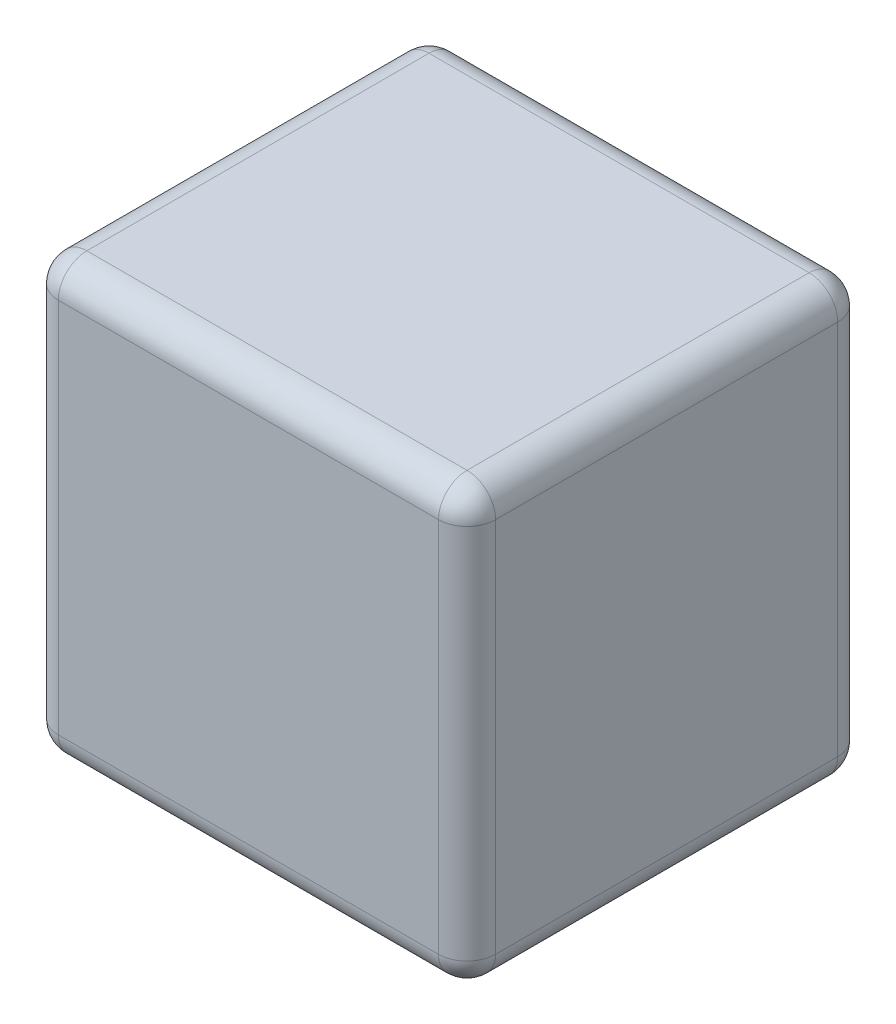
ISO-10303-21;
HEADER;
FILE_DESCRIPTION(('STEP AP214'),'2;1');
FILE_NAME('part.step','',(''),(''),'','','');
FILE_SCHEMA(('AUTOMOTIVE_DESIGN { 1 0 10303 214 1 1 1 1 }'));
ENDSEC;
DATA;
#1=APPLICATION_CONTEXT('core data for automotive mechanical design processes');
#2=APPLICATION_PROTOCOL_DEFINITION('international standard','automotive_design',2000,#1);
#3=PRODUCT_CONTEXT('',#1,'mechanical');
#4=PRODUCT('Part','Part','',(#3));
#5=PRODUCT_RELATED_PRODUCT_CATEGORY('part','',(#4));
#6=PRODUCT_DEFINITION_FORMATION('','',#4);
#7=PRODUCT_DEFINITION_CONTEXT('part definition',#1,'design');
#8=PRODUCT_DEFINITION('design','',#6,#7);
#9=PRODUCT_DEFINITION_SHAPE('','',#8);
#10=(LENGTH_UNIT() NAMED_UNIT(*) SI_UNIT(.MILLI.,.METRE.));
#11=(NAMED_UNIT(*) PLANE_ANGLE_UNIT() SI_UNIT($,.RADIAN.));
#12=(NAMED_UNIT(*) SI_UNIT($,.STERADIAN.) SOLID_ANGLE_UNIT());
#13=UNCERTAINTY_MEASURE_WITH_UNIT(LENGTH_MEASURE(1.E-05),#10,'distance_accuracy_value','');
#14=(GEOMETRIC_REPRESENTATION_CONTEXT(3) GLOBAL_UNCERTAINTY_ASSIGNED_CONTEXT((#13)) GLOBAL_UNIT_ASSIGNED_CONTEXT((#10,
#11,#12)) REPRESENTATION_CONTEXT('',''));
#15=CARTESIAN_POINT('',(0.,0.,0.));
#16=DIRECTION('',(0.,0.,1.));
#17=DIRECTION('',(1.,0.,0.));
#18=AXIS2_PLACEMENT_3D('',#15,#16,#17);
#19=CARTESIAN_POINT('',(56.000001208194,71.490000611925,2.25));
#20=DIRECTION('',(1.,1.19248806385E-08,0.));
#21=DIRECTION('',(0.,0.,1.));
#22=AXIS2_PLACEMENT_3D('',#19,#20,#21);
#23=SPHERICAL_SURFACE('',#22,0.15);
#24=CARTESIAN_POINT('',(56.000001208194,71.4900006119245,2.25));
#25=DIRECTION('',(1.,1.19248806385E-08,0.));
#26=DIRECTION('',(-1.19248806385E-08,1.,0.));
#27=AXIS2_PLACEMENT_3D('',#24,#25,#26);
#28=CIRCLE('',#27,0.15);
#29=CARTESIAN_POINT('',(56.0000012140971,71.4900006119251,2.4));
#30=VERTEX_POINT('',#29);
#31=CARTESIAN_POINT('',(56.0000012064059,71.640000611925,2.25000000000153));
#32=VERTEX_POINT('',#31);
#33=EDGE_CURVE('E116',#30,#32,#28,.F.);
#34=ORIENTED_EDGE('',*,*,#33,.F.);
#35=CARTESIAN_POINT('',(56.000001208194,71.4900006119253,2.25));
#36=DIRECTION('',(-1.19248806385E-08,1.,0.));
#37=DIRECTION('',(-1.,-1.19248806385E-08,0.));
#38=AXIS2_PLACEMENT_3D('',#35,#36,#37);
#39=CIRCLE('',#38,0.15);
#40=CARTESIAN_POINT('',(56.1500012081941,71.4900006134902,2.24999999999999));
#41=VERTEX_POINT('',#40);
#42=EDGE_CURVE('E107',#41,#30,#39,.F.);
#43=ORIENTED_EDGE('',*,*,#42,.F.);
#44=CARTESIAN_POINT('',(56.000001208194,71.490000611925,2.25));
#45=DIRECTION('',(0.,0.,1.));
#46=DIRECTION('',(1.,0.,0.));
#47=AXIS2_PLACEMENT_3D('',#44,#45,#46);
#48=CIRCLE('',#47,0.15);
#49=EDGE_CURVE('E118',#32,#41,#48,.F.);
#50=ORIENTED_EDGE('',*,*,#49,.F.);
#51=EDGE_LOOP('',(#34,#43,#50));
#52=FACE_BOUND('',#51,.T.);
#53=ADVANCED_FACE('F17',(#52),#23,.T.);
#54=CARTESIAN_POINT('',(54.000001208194,71.490000588075,2.25));
#55=DIRECTION('',(0.,0.,1.));
#56=DIRECTION('',(1.19248806385E-08,-1.,0.));
#57=AXIS2_PLACEMENT_3D('',#54,#55,#56);
#58=SPHERICAL_SURFACE('',#57,0.15);
#59=CARTESIAN_POINT('',(54.000001208194,71.490000588075,2.25));
#60=DIRECTION('',(0.,0.,-1.));
#61=DIRECTION('',(-1.,0.,0.));
#62=AXIS2_PLACEMENT_3D('',#59,#60,#61);
#63=CIRCLE('',#62,0.15);
#64=CARTESIAN_POINT('',(53.8500012081942,71.4900005865097,2.25));
#65=VERTEX_POINT('',#64);
#66=CARTESIAN_POINT('',(54.0000012064056,71.640000588075,2.25));
#67=VERTEX_POINT('',#66);
#68=EDGE_CURVE('E294',#65,#67,#63,.T.);
#69=ORIENTED_EDGE('',*,*,#68,.F.);
#70=CARTESIAN_POINT('',(54.0000012081947,71.490000588075,2.25));
#71=DIRECTION('',(1.19248806385E-08,-1.,0.));
#72=DIRECTION('',(1.,1.19248806385E-08,0.));
#73=AXIS2_PLACEMENT_3D('',#70,#71,#72);
#74=CIRCLE('',#73,0.15);
#75=CARTESIAN_POINT('',(54.0000012081945,71.4900005940375,2.4));
#76=VERTEX_POINT('',#75);
#77=EDGE_CURVE('E292',#76,#65,#74,.T.);
#78=ORIENTED_EDGE('',*,*,#77,.F.);
#79=CARTESIAN_POINT('',(54.0000012081947,71.4900005880747,2.25));
#80=DIRECTION('',(1.,1.19248806385E-08,0.));
#81=DIRECTION('',(-1.19248806385E-08,1.,0.));
#82=AXIS2_PLACEMENT_3D('',#79,#80,#81);
#83=CIRCLE('',#82,0.15);
#84=EDGE_CURVE('E128',#67,#76,#83,.T.);
#85=ORIENTED_EDGE('',*,*,#84,.F.);
#86=EDGE_LOOP('',(#69,#78,#85));
#87=FACE_BOUND('',#86,.T.);
#88=ADVANCED_FACE('F157',(#87),#58,.T.);
#89=CARTESIAN_POINT('',(56.000001231806,69.510000611925,2.25));
#90=DIRECTION('',(1.,1.19248806385E-08,0.));
#91=DIRECTION('',(0.,0.,-1.));
#92=AXIS2_PLACEMENT_3D('',#89,#90,#91);
#93=SPHERICAL_SURFACE('',#92,0.15);
#94=CARTESIAN_POINT('',(56.0000012318053,69.5100006119245,2.25));
#95=DIRECTION('',(1.,1.19248806385E-08,0.));
#96=DIRECTION('',(-1.19248806385E-08,1.,0.));
#97=AXIS2_PLACEMENT_3D('',#94,#95,#96);
#98=CIRCLE('',#97,0.15);
#99=CARTESIAN_POINT('',(56.0000012335944,69.360000611925,2.25));
#100=VERTEX_POINT('',#99);
#101=CARTESIAN_POINT('',(56.0000012318055,69.5100006094099,2.4));
#102=VERTEX_POINT('',#101);
#103=EDGE_CURVE('E300',#100,#102,#98,.F.);
#104=ORIENTED_EDGE('',*,*,#103,.F.);
#105=CARTESIAN_POINT('',(56.000001231806,69.510000611925,2.25));
#106=DIRECTION('',(0.,0.,1.));
#107=DIRECTION('',(1.,0.,0.));
#108=AXIS2_PLACEMENT_3D('',#105,#106,#107);
#109=CIRCLE('',#108,0.15);
#110=CARTESIAN_POINT('',(56.1500012318058,69.5100006134902,2.25));
#111=VERTEX_POINT('',#110);
#112=EDGE_CURVE('E298',#111,#100,#109,.F.);
#113=ORIENTED_EDGE('',*,*,#112,.F.);
#114=CARTESIAN_POINT('',(56.0000012318053,69.510000611925,2.25));
#115=DIRECTION('',(-1.19248806385E-08,1.,0.));
#116=DIRECTION('',(-1.,-1.19248806385E-08,0.));
#117=AXIS2_PLACEMENT_3D('',#114,#115,#116);
#118=CIRCLE('',#117,0.15);
#119=EDGE_CURVE('E137',#102,#111,#118,.T.);
#120=ORIENTED_EDGE('',*,*,#119,.F.);
#121=EDGE_LOOP('',(#104,#113,#120));
#122=FACE_BOUND('',#121,.T.);
#123=ADVANCED_FACE('F155',(#122),#93,.T.);
#124=CARTESIAN_POINT('',(58.665001197462,72.390000643705,2.4));
#125=DIRECTION('',(0.,0.,1.));
#126=DIRECTION('',(1.,0.,0.));
#127=AXIS2_PLACEMENT_3D('',#124,#125,#126);
#128=PLANE('',#127);
#129=DIRECTION('',(1.19248806385E-08,-1.,0.));
#130=VECTOR('',#129,1.);
#131=CARTESIAN_POINT('',(54.000001206406,71.640000588075,2.4));
#132=LINE('',#131,#130);
#133=CARTESIAN_POINT('',(54.0000012252529,69.5100005880749,2.4));
#134=VERTEX_POINT('',#133);
#135=EDGE_CURVE('E289',#134,#76,#132,.F.);
#136=ORIENTED_EDGE('',*,*,#135,.F.);
#137=DIRECTION('',(1.,1.19248806385E-08,0.));
#138=VECTOR('',#137,1.);
#139=CARTESIAN_POINT('',(53.850001231806,69.5100005862865,2.4));
#140=LINE('',#139,#138);
#141=EDGE_CURVE('E135',#102,#134,#140,.F.);
#142=ORIENTED_EDGE('',*,*,#141,.F.);
#143=DIRECTION('',(-1.19248806385E-08,1.,0.));
#144=VECTOR('',#143,1.);
#145=CARTESIAN_POINT('',(56.000001233594,69.360000611925,2.4));
#146=LINE('',#145,#144);
#147=EDGE_CURVE('E103',#30,#102,#146,.F.);
#148=ORIENTED_EDGE('',*,*,#147,.F.);
#149=DIRECTION('',(1.,1.19248806385E-08,0.));
#150=VECTOR('',#149,1.);
#151=CARTESIAN_POINT('',(53.850001208194,71.4900005862863,2.4));
#152=LINE('',#151,#150);
#153=EDGE_CURVE('E123',#76,#30,#152,.T.);
#154=ORIENTED_EDGE('',*,*,#153,.F.);
#155=EDGE_LOOP('',(#136,#142,#148,#154));
#156=FACE_BOUND('',#155,.T.);
#157=ADVANCED_FACE('F133',(#156),#128,.T.);
#158=CARTESIAN_POINT('',(54.000001231806,69.510000588075,2.25));
#159=DIRECTION('',(1.19248806385E-08,-1.,0.));
#160=DIRECTION('',(0.,0.,-1.));
#161=AXIS2_PLACEMENT_3D('',#158,#159,#160);
#162=SPHERICAL_SURFACE('',#161,0.15);
#163=CARTESIAN_POINT('',(54.000001231806,69.5100005880747,2.25));
#164=DIRECTION('',(1.19248806385E-08,-1.,0.));
#165=DIRECTION('',(1.,1.19248806385E-08,0.));
#166=AXIS2_PLACEMENT_3D('',#163,#164,#165);
#167=CIRCLE('',#166,0.15);
#168=CARTESIAN_POINT('',(53.850001231806,69.5100005867334,2.25));
#169=VERTEX_POINT('',#168);
#170=EDGE_CURVE('E122',#169,#134,#167,.F.);
#171=ORIENTED_EDGE('',*,*,#170,.F.);
#172=CARTESIAN_POINT('',(54.000001231806,69.510000588075,2.25));
#173=DIRECTION('',(0.,0.,-1.));
#174=DIRECTION('',(-1.,0.,0.));
#175=AXIS2_PLACEMENT_3D('',#172,#173,#174);
#176=CIRCLE('',#175,0.15);
#177=CARTESIAN_POINT('',(54.0000012335946,69.360000588075,2.25));
#178=VERTEX_POINT('',#177);
#179=EDGE_CURVE('E305',#178,#169,#176,.T.);
#180=ORIENTED_EDGE('',*,*,#179,.F.);
#181=CARTESIAN_POINT('',(54.000001231806,69.5100005880747,2.25));
#182=DIRECTION('',(1.,1.19248806385E-08,0.));
#183=DIRECTION('',(-1.19248806385E-08,1.,0.));
#184=AXIS2_PLACEMENT_3D('',#181,#182,#183);
#185=CIRCLE('',#184,0.15);
#186=EDGE_CURVE('E303',#134,#178,#185,.T.);
#187=ORIENTED_EDGE('',*,*,#186,.F.);
#188=EDGE_LOOP('',(#171,#180,#187));
#189=FACE_BOUND('',#188,.T.);
#190=ADVANCED_FACE('F147',(#189),#162,.T.);
#191=CARTESIAN_POINT('',(56.000001233594,69.360000611925,2.25));
#192=DIRECTION('',(-1.19248806385E-08,1.,0.));
#193=DIRECTION('',(-1.,-1.19248806385E-08,0.));
#194=AXIS2_PLACEMENT_3D('',#191,#192,#193);
#195=CYLINDRICAL_SURFACE('',#194,0.15);
#196=ORIENTED_EDGE('',*,*,#119,.T.);
#197=DIRECTION('',(-1.19248806385E-08,1.,0.));
#198=VECTOR('',#197,1.);
#199=CARTESIAN_POINT('',(56.150001247189,68.220000613714,2.25));
#200=LINE('',#199,#198);
#201=EDGE_CURVE('E111',#41,#111,#200,.F.);
#202=ORIENTED_EDGE('',*,*,#201,.F.);
#203=ORIENTED_EDGE('',*,*,#42,.T.);
#204=ORIENTED_EDGE('',*,*,#147,.T.);
#205=EDGE_LOOP('',(#196,#202,#203,#204));
#206=FACE_BOUND('',#205,.T.);
#207=ADVANCED_FACE('F109',(#206),#195,.T.);
#208=CARTESIAN_POINT('',(56.000001208194,71.490000611925,0.3));
#209=DIRECTION('',(0.,0.,1.));
#210=DIRECTION('',(1.,0.,0.));
#211=AXIS2_PLACEMENT_3D('',#208,#209,#210);
#212=CYLINDRICAL_SURFACE('',#211,0.15);
#213=ORIENTED_EDGE('',*,*,#49,.T.);
#214=DIRECTION('',(0.,0.,1.));
#215=VECTOR('',#214,1.);
#216=CARTESIAN_POINT('',(56.1500012081946,71.490000613714,5.3));
#217=LINE('',#216,#215);
#218=CARTESIAN_POINT('',(56.1500012081941,71.4900006128194,0.449999999999997));
#219=VERTEX_POINT('',#218);
#220=EDGE_CURVE('E281',#219,#41,#217,.T.);
#221=ORIENTED_EDGE('',*,*,#220,.F.);
#222=CARTESIAN_POINT('',(56.000001208194,71.490000611925,0.45));
#223=DIRECTION('',(0.,0.,1.));
#224=DIRECTION('',(1.,0.,0.));
#225=AXIS2_PLACEMENT_3D('',#222,#223,#224);
#226=CIRCLE('',#225,0.15);
#227=CARTESIAN_POINT('',(56.0000012064059,71.6400006119251,0.449999999999999));
#228=VERTEX_POINT('',#227);
#229=EDGE_CURVE('E139',#219,#228,#226,.T.);
#230=ORIENTED_EDGE('',*,*,#229,.T.);
#231=DIRECTION('',(0.,0.,1.));
#232=VECTOR('',#231,1.);
#233=CARTESIAN_POINT('',(56.000001206406,71.6400006119252,2.57));
#234=LINE('',#233,#232);
#235=EDGE_CURVE('E284',#228,#32,#234,.T.);
#236=ORIENTED_EDGE('',*,*,#235,.T.);
#237=EDGE_LOOP('',(#213,#221,#230,#236));
#238=FACE_BOUND('',#237,.T.);
#239=ADVANCED_FACE('F273',(#238),#212,.T.);
#240=CARTESIAN_POINT('',(53.850001208194,71.490000586286,2.25));
#241=DIRECTION('',(1.,1.19248806385E-08,0.));
#242=DIRECTION('',(-1.19248806385E-08,1.,0.));
#243=AXIS2_PLACEMENT_3D('',#240,#241,#242);
#244=CYLINDRICAL_SURFACE('',#243,0.15);
#245=ORIENTED_EDGE('',*,*,#153,.T.);
#246=ORIENTED_EDGE('',*,*,#33,.T.);
#247=DIRECTION('',(1.,1.19248806385E-08,0.));
#248=VECTOR('',#247,1.);
#249=CARTESIAN_POINT('',(58.665001206406,71.640000643705,2.25));
#250=LINE('',#249,#248);
#251=EDGE_CURVE('E313',#32,#67,#250,.F.);
#252=ORIENTED_EDGE('',*,*,#251,.T.);
#253=ORIENTED_EDGE('',*,*,#84,.T.);
#254=EDGE_LOOP('',(#245,#246,#252,#253));
#255=FACE_BOUND('',#254,.T.);
#256=ADVANCED_FACE('F126',(#255),#244,.T.);
#257=CARTESIAN_POINT('',(54.000001206406,71.640000588075,2.25));
#258=DIRECTION('',(1.19248806385E-08,-1.,0.));
#259=DIRECTION('',(1.,1.19248806385E-08,0.));
#260=AXIS2_PLACEMENT_3D('',#257,#258,#259);
#261=CYLINDRICAL_SURFACE('',#260,0.15);
#262=ORIENTED_EDGE('',*,*,#135,.T.);
#263=ORIENTED_EDGE('',*,*,#77,.T.);
#264=DIRECTION('',(1.19248806385E-08,-1.,0.));
#265=VECTOR('',#264,1.);
#266=CARTESIAN_POINT('',(53.850001196985,72.430000586286,2.25));
#267=LINE('',#266,#265);
#268=EDGE_CURVE('E230',#169,#65,#267,.F.);
#269=ORIENTED_EDGE('',*,*,#268,.F.);
#270=ORIENTED_EDGE('',*,*,#170,.T.);
#271=EDGE_LOOP('',(#262,#263,#269,#270));
#272=FACE_BOUND('',#271,.T.);
#273=ADVANCED_FACE('F267',(#272),#261,.T.);
#274=CARTESIAN_POINT('',(54.000001208194,71.490000588075,2.4));
#275=DIRECTION('',(0.,0.,-1.));
#276=DIRECTION('',(-1.,0.,0.));
#277=AXIS2_PLACEMENT_3D('',#274,#275,#276);
#278=CYLINDRICAL_SURFACE('',#277,0.15);
#279=CARTESIAN_POINT('',(54.000001208194,71.490000588075,0.45));
#280=DIRECTION('',(0.,0.,-1.));
#281=DIRECTION('',(-1.,0.,0.));
#282=AXIS2_PLACEMENT_3D('',#279,#280,#281);
#283=CIRCLE('',#282,0.15);
#284=CARTESIAN_POINT('',(54.0000012064057,71.6400005880751,0.45));
#285=VERTEX_POINT('',#284);
#286=CARTESIAN_POINT('',(53.8500012081942,71.4900005871805,0.45));
#287=VERTEX_POINT('',#286);
#288=EDGE_CURVE('E296',#285,#287,#283,.F.);
#289=ORIENTED_EDGE('',*,*,#288,.T.);
#290=DIRECTION('',(0.,0.,1.));
#291=VECTOR('',#290,1.);
#292=CARTESIAN_POINT('',(53.8500012081944,71.490000586286,5.3));
#293=LINE('',#292,#291);
#294=EDGE_CURVE('E227',#65,#287,#293,.F.);
#295=ORIENTED_EDGE('',*,*,#294,.F.);
#296=ORIENTED_EDGE('',*,*,#68,.T.);
#297=DIRECTION('',(0.,0.,1.));
#298=VECTOR('',#297,1.);
#299=CARTESIAN_POINT('',(54.000001206406,71.6400005880754,2.57));
#300=LINE('',#299,#298);
#301=EDGE_CURVE('E236',#67,#285,#300,.F.);
#302=ORIENTED_EDGE('',*,*,#301,.T.);
#303=EDGE_LOOP('',(#289,#295,#296,#302));
#304=FACE_BOUND('',#303,.T.);
#305=ADVANCED_FACE('F263',(#304),#278,.T.);
#306=CARTESIAN_POINT('',(56.000001231806,69.510000611925,0.3));
#307=DIRECTION('',(0.,0.,1.));
#308=DIRECTION('',(1.,0.,0.));
#309=AXIS2_PLACEMENT_3D('',#306,#307,#308);
#310=CYLINDRICAL_SURFACE('',#309,0.15);
#311=DIRECTION('',(0.,0.,1.));
#312=VECTOR('',#311,1.);
#313=CARTESIAN_POINT('',(56.000001233594,69.3600006119252,2.57));
#314=LINE('',#313,#312);
#315=CARTESIAN_POINT('',(56.0000012335941,69.3600006119251,0.449999999999519));
#316=VERTEX_POINT('',#315);
#317=EDGE_CURVE('E208',#316,#100,#314,.T.);
#318=ORIENTED_EDGE('',*,*,#317,.F.);
#319=CARTESIAN_POINT('',(56.000001231806,69.510000611925,0.449999999999992));
#320=DIRECTION('',(0.,1.27771510488082E-11,-1.));
#321=DIRECTION('',(1.,1.19248805951319E-08,0.));
#322=AXIS2_PLACEMENT_3D('',#319,#320,#321);
#323=CIRCLE('',#322,0.15);
#324=CARTESIAN_POINT('',(56.1500012318059,69.5100006128195,0.449999999999999));
#325=VERTEX_POINT('',#324);
#326=EDGE_CURVE('E211',#325,#316,#323,.T.);
#327=ORIENTED_EDGE('',*,*,#326,.F.);
#328=DIRECTION('',(0.,0.,1.));
#329=VECTOR('',#328,1.);
#330=CARTESIAN_POINT('',(56.1500012318059,69.510000613714,5.3));
#331=LINE('',#330,#329);
#332=EDGE_CURVE('E310',#111,#325,#331,.F.);
#333=ORIENTED_EDGE('',*,*,#332,.F.);
#334=ORIENTED_EDGE('',*,*,#112,.T.);
#335=EDGE_LOOP('',(#318,#327,#333,#334));
#336=FACE_BOUND('',#335,.T.);
#337=ADVANCED_FACE('F259',(#336),#310,.T.);
#338=CARTESIAN_POINT('',(53.850001231806,69.510000586286,2.25));
#339=DIRECTION('',(1.,1.19248806385E-08,0.));
#340=DIRECTION('',(-1.19248806385E-08,1.,0.));
#341=AXIS2_PLACEMENT_3D('',#338,#339,#340);
#342=CYLINDRICAL_SURFACE('',#341,0.15);
#343=ORIENTED_EDGE('',*,*,#186,.T.);
#344=DIRECTION('',(1.,1.19248806385E-08,0.));
#345=VECTOR('',#344,1.);
#346=CARTESIAN_POINT('',(58.665001233594,69.360000643705,2.25));
#347=LINE('',#346,#345);
#348=EDGE_CURVE('E205',#100,#178,#347,.F.);
#349=ORIENTED_EDGE('',*,*,#348,.F.);
#350=ORIENTED_EDGE('',*,*,#103,.T.);
#351=ORIENTED_EDGE('',*,*,#141,.T.);
#352=EDGE_LOOP('',(#343,#349,#350,#351));
#353=FACE_BOUND('',#352,.T.);
#354=ADVANCED_FACE('F255',(#353),#342,.T.);
#355=CARTESIAN_POINT('',(54.000001231806,69.510000588075,2.4));
#356=DIRECTION('',(0.,0.,-1.));
#357=DIRECTION('',(-1.,0.,0.));
#358=AXIS2_PLACEMENT_3D('',#355,#356,#357);
#359=CYLINDRICAL_SURFACE('',#358,0.15);
#360=CARTESIAN_POINT('',(54.000001231806,69.510000588075,0.45));
#361=DIRECTION('',(0.,0.,-1.));
#362=DIRECTION('',(-1.,0.,0.));
#363=AXIS2_PLACEMENT_3D('',#360,#361,#362);
#364=CIRCLE('',#363,0.15);
#365=CARTESIAN_POINT('',(53.850001231806,69.5100005871805,0.45));
#366=VERTEX_POINT('',#365);
#367=CARTESIAN_POINT('',(54.0000012335941,69.3600005880752,0.45));
#368=VERTEX_POINT('',#367);
#369=EDGE_CURVE('E307',#366,#368,#364,.F.);
#370=ORIENTED_EDGE('',*,*,#369,.T.);
#371=DIRECTION('',(0.,0.,1.));
#372=VECTOR('',#371,1.);
#373=CARTESIAN_POINT('',(54.000001233594,69.3600005880754,2.57));
#374=LINE('',#373,#372);
#375=EDGE_CURVE('E202',#178,#368,#374,.F.);
#376=ORIENTED_EDGE('',*,*,#375,.F.);
#377=ORIENTED_EDGE('',*,*,#179,.T.);
#378=DIRECTION('',(0.,0.,1.));
#379=VECTOR('',#378,1.);
#380=CARTESIAN_POINT('',(53.8500012318056,69.510000586286,5.3));
#381=LINE('',#380,#379);
#382=EDGE_CURVE('E233',#366,#169,#381,.T.);
#383=ORIENTED_EDGE('',*,*,#382,.F.);
#384=EDGE_LOOP('',(#370,#376,#377,#383));
#385=FACE_BOUND('',#384,.T.);
#386=ADVANCED_FACE('F251',(#385),#359,.T.);
#387=CARTESIAN_POINT('',(56.150001247189,68.220000613714,5.3));
#388=DIRECTION('',(1.,1.19248806385E-08,0.));
#389=DIRECTION('',(-1.19248806385E-08,1.,0.));
#390=AXIS2_PLACEMENT_3D('',#387,#388,#389);
#391=PLANE('',#390);
#392=DIRECTION('',(-1.19248806385E-08,1.,0.));
#393=VECTOR('',#392,1.);
#394=CARTESIAN_POINT('',(56.150001233594,69.3600006137137,0.45));
#395=LINE('',#394,#393);
#396=EDGE_CURVE('E331',#219,#325,#395,.F.);
#397=ORIENTED_EDGE('',*,*,#396,.F.);
#398=ORIENTED_EDGE('',*,*,#220,.T.);
#399=ORIENTED_EDGE('',*,*,#201,.T.);
#400=ORIENTED_EDGE('',*,*,#332,.T.);
#401=EDGE_LOOP('',(#397,#398,#399,#400));
#402=FACE_BOUND('',#401,.T.);
#403=ADVANCED_FACE('F247',(#402),#391,.T.);
#404=CARTESIAN_POINT('',(58.665001206406,71.640000643705,2.57));
#405=DIRECTION('',(1.19248806385E-08,-1.,0.));
#406=DIRECTION('',(1.,1.19248806385E-08,0.));
#407=AXIS2_PLACEMENT_3D('',#404,#405,#406);
#408=PLANE('',#407);
#409=ORIENTED_EDGE('',*,*,#301,.F.);
#410=ORIENTED_EDGE('',*,*,#251,.F.);
#411=ORIENTED_EDGE('',*,*,#235,.F.);
#412=DIRECTION('',(-1.,-1.19248806385E-08,0.));
#413=VECTOR('',#412,1.);
#414=CARTESIAN_POINT('',(56.1500012064053,71.640000613714,0.45));
#415=LINE('',#414,#413);
#416=EDGE_CURVE('E319',#285,#228,#415,.F.);
#417=ORIENTED_EDGE('',*,*,#416,.F.);
#418=EDGE_LOOP('',(#409,#410,#411,#417));
#419=FACE_BOUND('',#418,.T.);
#420=ADVANCED_FACE('F243',(#419),#408,.F.);
#421=CARTESIAN_POINT('',(56.000001208194,71.490000611925,0.45));
#422=DIRECTION('',(1.,1.19248806385E-08,0.));
#423=DIRECTION('',(0.,0.,1.));
#424=AXIS2_PLACEMENT_3D('',#421,#422,#423);
#425=SPHERICAL_SURFACE('',#424,0.15);
#426=CARTESIAN_POINT('',(56.0000012081947,71.4900006119253,0.45));
#427=DIRECTION('',(-1.,-1.19248806385E-08,0.));
#428=DIRECTION('',(1.19248806385E-08,-1.,0.));
#429=AXIS2_PLACEMENT_3D('',#426,#427,#428);
#430=CIRCLE('',#429,0.15);
#431=CARTESIAN_POINT('',(56.0000012111458,71.4900006129063,0.3));
#432=VERTEX_POINT('',#431);
#433=EDGE_CURVE('E322',#228,#432,#430,.T.);
#434=ORIENTED_EDGE('',*,*,#433,.F.);
#435=ORIENTED_EDGE('',*,*,#229,.F.);
#436=CARTESIAN_POINT('',(56.000001208194,71.490000611925,0.45));
#437=DIRECTION('',(-1.19248806385E-08,1.,0.));
#438=DIRECTION('',(-1.,-1.19248806385E-08,0.));
#439=AXIS2_PLACEMENT_3D('',#436,#437,#438);
#440=CIRCLE('',#439,0.15);
#441=EDGE_CURVE('E200',#432,#219,#440,.F.);
#442=ORIENTED_EDGE('',*,*,#441,.F.);
#443=EDGE_LOOP('',(#434,#435,#442));
#444=FACE_BOUND('',#443,.T.);
#445=ADVANCED_FACE('F240',(#444),#425,.T.);
#446=CARTESIAN_POINT('',(53.850001196985,72.430000586286,5.3));
#447=DIRECTION('',(-1.,-1.19248806385E-08,0.));
#448=DIRECTION('',(1.19248806385E-08,-1.,0.));
#449=AXIS2_PLACEMENT_3D('',#446,#447,#448);
#450=PLANE('',#449);
#451=ORIENTED_EDGE('',*,*,#294,.T.);
#452=DIRECTION('',(1.19248806385E-08,-1.,0.));
#453=VECTOR('',#452,1.);
#454=CARTESIAN_POINT('',(53.850001206406,71.6400005862863,0.45));
#455=LINE('',#454,#453);
#456=EDGE_CURVE('E357',#366,#287,#455,.F.);
#457=ORIENTED_EDGE('',*,*,#456,.F.);
#458=ORIENTED_EDGE('',*,*,#382,.T.);
#459=ORIENTED_EDGE('',*,*,#268,.T.);
#460=EDGE_LOOP('',(#451,#457,#458,#459));
#461=FACE_BOUND('',#460,.T.);
#462=ADVANCED_FACE('F222',(#461),#450,.T.);
#463=CARTESIAN_POINT('',(54.000001208194,71.490000588075,0.45));
#464=DIRECTION('',(0.,0.,-1.));
#465=DIRECTION('',(-1.19248806385E-08,1.,0.));
#466=AXIS2_PLACEMENT_3D('',#463,#464,#465);
#467=SPHERICAL_SURFACE('',#466,0.15);
#468=ORIENTED_EDGE('',*,*,#288,.F.);
#469=CARTESIAN_POINT('',(54.000001208194,71.4900005880755,0.450000000000001));
#470=DIRECTION('',(-1.,-1.19248806385E-08,0.));
#471=DIRECTION('',(1.19248806385E-08,-1.,0.));
#472=AXIS2_PLACEMENT_3D('',#469,#470,#471);
#473=CIRCLE('',#472,0.15);
#474=CARTESIAN_POINT('',(54.000001208194,71.4900005910563,0.3));
#475=VERTEX_POINT('',#474);
#476=EDGE_CURVE('E323',#475,#285,#473,.F.);
#477=ORIENTED_EDGE('',*,*,#476,.F.);
#478=CARTESIAN_POINT('',(54.0000012081947,71.4900005880747,0.45));
#479=DIRECTION('',(1.19248806385E-08,-1.,0.));
#480=DIRECTION('',(1.,1.19248806385E-08,0.));
#481=AXIS2_PLACEMENT_3D('',#478,#479,#480);
#482=CIRCLE('',#481,0.15);
#483=EDGE_CURVE('E355',#287,#475,#482,.T.);
#484=ORIENTED_EDGE('',*,*,#483,.F.);
#485=EDGE_LOOP('',(#468,#477,#484));
#486=FACE_BOUND('',#485,.T.);
#487=ADVANCED_FACE('F218',(#486),#467,.T.);
#488=CARTESIAN_POINT('',(56.000001231806,69.510000611925,0.45));
#489=DIRECTION('',(1.,1.19248806385E-08,0.));
#490=DIRECTION('',(0.,0.,-1.));
#491=AXIS2_PLACEMENT_3D('',#488,#489,#490);
#492=SPHERICAL_SURFACE('',#491,0.15);
#493=CARTESIAN_POINT('',(56.000001231806,69.5100006119253,0.45));
#494=DIRECTION('',(-1.,-1.19248806385E-08,0.));
#495=DIRECTION('',(1.19248806385E-08,-1.,0.));
#496=AXIS2_PLACEMENT_3D('',#493,#494,#495);
#497=CIRCLE('',#496,0.15);
#498=CARTESIAN_POINT('',(56.0000012318056,69.5100006089438,0.3));
#499=VERTEX_POINT('',#498);
#500=EDGE_CURVE('E352',#499,#316,#497,.T.);
#501=ORIENTED_EDGE('',*,*,#500,.F.);
#502=CARTESIAN_POINT('',(56.0000012318053,69.5100006119253,0.45));
#503=DIRECTION('',(-1.19248806385E-08,1.,0.));
#504=DIRECTION('',(-1.,-1.19248806385E-08,0.));
#505=AXIS2_PLACEMENT_3D('',#502,#503,#504);
#506=CIRCLE('',#505,0.15);
#507=EDGE_CURVE('E327',#325,#499,#506,.T.);
#508=ORIENTED_EDGE('',*,*,#507,.F.);
#509=ORIENTED_EDGE('',*,*,#326,.T.);
#510=EDGE_LOOP('',(#501,#508,#509));
#511=FACE_BOUND('',#510,.T.);
#512=ADVANCED_FACE('F215',(#511),#492,.T.);
#513=CARTESIAN_POINT('',(58.665001233594,69.360000643705,2.57));
#514=DIRECTION('',(1.19248806385E-08,-1.,0.));
#515=DIRECTION('',(1.,1.19248806385E-08,0.));
#516=AXIS2_PLACEMENT_3D('',#513,#514,#515);
#517=PLANE('',#516);
#518=ORIENTED_EDGE('',*,*,#375,.T.);
#519=DIRECTION('',(-1.,-1.19248806385E-08,0.));
#520=VECTOR('',#519,1.);
#521=CARTESIAN_POINT('',(56.1500012335947,69.360000613714,0.45));
#522=LINE('',#521,#520);
#523=EDGE_CURVE('E350',#316,#368,#522,.T.);
#524=ORIENTED_EDGE('',*,*,#523,.F.);
#525=ORIENTED_EDGE('',*,*,#317,.T.);
#526=ORIENTED_EDGE('',*,*,#348,.T.);
#527=EDGE_LOOP('',(#518,#524,#525,#526));
#528=FACE_BOUND('',#527,.T.);
#529=ADVANCED_FACE('F194',(#528),#517,.T.);
#530=CARTESIAN_POINT('',(54.000001231806,69.510000588075,0.45));
#531=DIRECTION('',(1.19248806385E-08,-1.,0.));
#532=DIRECTION('',(1.,1.19248806385E-08,0.));
#533=AXIS2_PLACEMENT_3D('',#530,#531,#532);
#534=SPHERICAL_SURFACE('',#533,0.15);
#535=CARTESIAN_POINT('',(54.000001231806,69.510000588075,0.45));
#536=DIRECTION('',(1.19248806385E-08,-1.,0.));
#537=DIRECTION('',(1.,1.19248806385E-08,0.));
#538=AXIS2_PLACEMENT_3D('',#535,#536,#537);
#539=CIRCLE('',#538,0.15);
#540=CARTESIAN_POINT('',(54.0000012288542,69.5100005880749,0.300000000000001));
#541=VERTEX_POINT('',#540);
#542=EDGE_CURVE('E325',#541,#366,#539,.F.);
#543=ORIENTED_EDGE('',*,*,#542,.F.);
#544=CARTESIAN_POINT('',(54.0000012318053,69.5100005880755,0.450000000000001));
#545=DIRECTION('',(-1.,-1.19248806385E-08,0.));
#546=DIRECTION('',(1.19248806385E-08,-1.,0.));
#547=AXIS2_PLACEMENT_3D('',#544,#545,#546);
#548=CIRCLE('',#547,0.15);
#549=EDGE_CURVE('E34',#368,#541,#548,.F.);
#550=ORIENTED_EDGE('',*,*,#549,.F.);
#551=ORIENTED_EDGE('',*,*,#369,.F.);
#552=EDGE_LOOP('',(#543,#550,#551));
#553=FACE_BOUND('',#552,.T.);
#554=ADVANCED_FACE('F189',(#553),#534,.T.);
#555=CARTESIAN_POINT('',(56.000001233594,69.360000611925,0.45));
#556=DIRECTION('',(-1.19248806385E-08,1.,0.));
#557=DIRECTION('',(-1.,-1.19248806385E-08,0.));
#558=AXIS2_PLACEMENT_3D('',#555,#556,#557);
#559=CYLINDRICAL_SURFACE('',#558,0.15);
#560=ORIENTED_EDGE('',*,*,#507,.T.);
#561=DIRECTION('',(0.,1.,0.));
#562=VECTOR('',#561,1.);
#563=CARTESIAN_POINT('',(56.000001231806,71.780000643705,0.300000000000001));
#564=LINE('',#563,#562);
#565=EDGE_CURVE('E338',#499,#432,#564,.T.);
#566=ORIENTED_EDGE('',*,*,#565,.T.);
#567=ORIENTED_EDGE('',*,*,#441,.T.);
#568=ORIENTED_EDGE('',*,*,#396,.T.);
#569=EDGE_LOOP('',(#560,#566,#567,#568));
#570=FACE_BOUND('',#569,.T.);
#571=ADVANCED_FACE('F185',(#570),#559,.T.);
#572=CARTESIAN_POINT('',(56.150001208194,71.490000613714,0.45));
#573=DIRECTION('',(-1.,-1.19248806385E-08,0.));
#574=DIRECTION('',(1.19248806385E-08,-1.,0.));
#575=AXIS2_PLACEMENT_3D('',#572,#573,#574);
#576=CYLINDRICAL_SURFACE('',#575,0.15);
#577=ORIENTED_EDGE('',*,*,#416,.T.);
#578=ORIENTED_EDGE('',*,*,#433,.T.);
#579=DIRECTION('',(1.,0.,0.));
#580=VECTOR('',#579,1.);
#581=CARTESIAN_POINT('',(58.665001204736,71.490000611925,0.3));
#582=LINE('',#581,#580);
#583=EDGE_CURVE('E341',#432,#475,#582,.F.);
#584=ORIENTED_EDGE('',*,*,#583,.T.);
#585=ORIENTED_EDGE('',*,*,#476,.T.);
#586=EDGE_LOOP('',(#577,#578,#584,#585));
#587=FACE_BOUND('',#586,.T.);
#588=ADVANCED_FACE('F181',(#587),#576,.T.);
#589=CARTESIAN_POINT('',(54.000001206406,71.640000588075,0.45));
#590=DIRECTION('',(1.19248806385E-08,-1.,0.));
#591=DIRECTION('',(1.,1.19248806385E-08,0.));
#592=AXIS2_PLACEMENT_3D('',#589,#590,#591);
#593=CYLINDRICAL_SURFACE('',#592,0.15);
#594=ORIENTED_EDGE('',*,*,#456,.T.);
#595=ORIENTED_EDGE('',*,*,#483,.T.);
#596=DIRECTION('',(0.,1.,0.));
#597=VECTOR('',#596,1.);
#598=CARTESIAN_POINT('',(54.000001208194,71.780000643705,0.300000000000001));
#599=LINE('',#598,#597);
#600=EDGE_CURVE('E26',#475,#541,#599,.F.);
#601=ORIENTED_EDGE('',*,*,#600,.T.);
#602=ORIENTED_EDGE('',*,*,#542,.T.);
#603=EDGE_LOOP('',(#594,#595,#601,#602));
#604=FACE_BOUND('',#603,.T.);
#605=ADVANCED_FACE('F175',(#604),#593,.T.);
#606=CARTESIAN_POINT('',(56.150001231806,69.510000613714,0.45));
#607=DIRECTION('',(-1.,-1.19248806385E-08,0.));
#608=DIRECTION('',(1.19248806385E-08,-1.,0.));
#609=AXIS2_PLACEMENT_3D('',#606,#607,#608);
#610=CYLINDRICAL_SURFACE('',#609,0.15);
#611=ORIENTED_EDGE('',*,*,#549,.T.);
#612=DIRECTION('',(1.,0.,0.));
#613=VECTOR('',#612,1.);
#614=CARTESIAN_POINT('',(58.665001204736,69.510000588075,0.3));
#615=LINE('',#614,#613);
#616=EDGE_CURVE('E11',#541,#499,#615,.T.);
#617=ORIENTED_EDGE('',*,*,#616,.T.);
#618=ORIENTED_EDGE('',*,*,#500,.T.);
#619=ORIENTED_EDGE('',*,*,#523,.T.);
#620=EDGE_LOOP('',(#611,#617,#618,#619));
#621=FACE_BOUND('',#620,.T.);
#622=ADVANCED_FACE('F169',(#621),#610,.T.);
#623=CARTESIAN_POINT('',(58.665001204736,71.780000643705,0.3));
#624=DIRECTION('',(0.,0.,1.));
#625=DIRECTION('',(1.,0.,0.));
#626=AXIS2_PLACEMENT_3D('',#623,#624,#625);
#627=PLANE('',#626);
#628=ORIENTED_EDGE('',*,*,#600,.F.);
#629=ORIENTED_EDGE('',*,*,#583,.F.);
#630=ORIENTED_EDGE('',*,*,#565,.F.);
#631=ORIENTED_EDGE('',*,*,#616,.F.);
#632=EDGE_LOOP('',(#628,#629,#630,#631));
#633=FACE_BOUND('',#632,.T.);
#634=ADVANCED_FACE('F167',(#633),#627,.F.);
#635=CLOSED_SHELL('',(#53,#88,#123,#157,#190,#207,#239,#256,#273,#305,#337,#354,#386,#403,#420,
#445,#462,#487,#512,#529,#554,#571,#588,#605,#622,#634));
#636=MANIFOLD_SOLID_BREP('B1',#635);
#637=ADVANCED_BREP_SHAPE_REPRESENTATION('',(#18,#636),#14);
#638=SHAPE_DEFINITION_REPRESENTATION(#9,#637);
ENDSEC;
END-ISO-10303-21;
